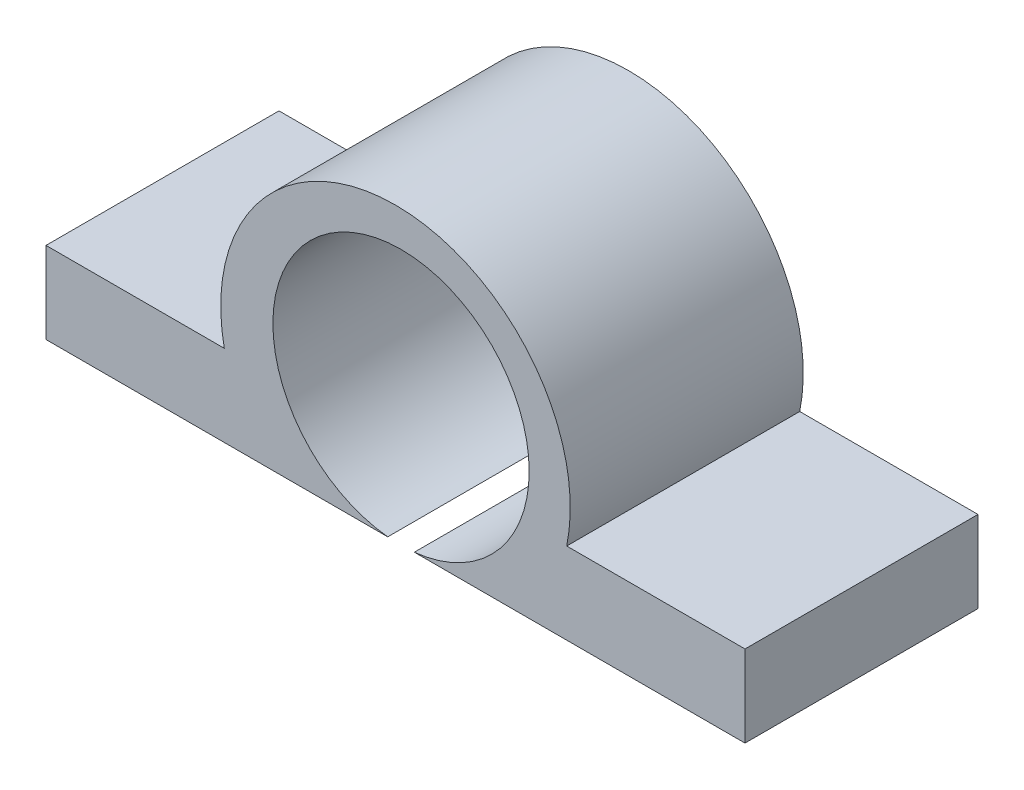
ISO-10303-21;
HEADER;
FILE_DESCRIPTION(('STEP AP214'),'2;1');
FILE_NAME('part.step','',(''),(''),'','','');
FILE_SCHEMA(('AUTOMOTIVE_DESIGN { 1 0 10303 214 1 1 1 1 }'));
ENDSEC;
DATA;
#1=APPLICATION_CONTEXT('core data for automotive mechanical design processes');
#2=APPLICATION_PROTOCOL_DEFINITION('international standard','automotive_design',2000,#1);
#3=PRODUCT_CONTEXT('',#1,'mechanical');
#4=PRODUCT('Part','Part','',(#3));
#5=PRODUCT_RELATED_PRODUCT_CATEGORY('part','',(#4));
#6=PRODUCT_DEFINITION_FORMATION('','',#4);
#7=PRODUCT_DEFINITION_CONTEXT('part definition',#1,'design');
#8=PRODUCT_DEFINITION('design','',#6,#7);
#9=PRODUCT_DEFINITION_SHAPE('','',#8);
#10=(LENGTH_UNIT() NAMED_UNIT(*) SI_UNIT(.MILLI.,.METRE.));
#11=(NAMED_UNIT(*) PLANE_ANGLE_UNIT() SI_UNIT($,.RADIAN.));
#12=(NAMED_UNIT(*) SI_UNIT($,.STERADIAN.) SOLID_ANGLE_UNIT());
#13=UNCERTAINTY_MEASURE_WITH_UNIT(LENGTH_MEASURE(1.E-05),#10,'distance_accuracy_value','');
#14=(GEOMETRIC_REPRESENTATION_CONTEXT(3) GLOBAL_UNCERTAINTY_ASSIGNED_CONTEXT((#13)) GLOBAL_UNIT_ASSIGNED_CONTEXT((#10,
#11,#12)) REPRESENTATION_CONTEXT('',''));
#15=CARTESIAN_POINT('',(0.,0.,0.));
#16=DIRECTION('',(0.,0.,1.));
#17=DIRECTION('',(1.,0.,0.));
#18=AXIS2_PLACEMENT_3D('',#15,#16,#17);
#19=CARTESIAN_POINT('',(-30.,-3.5,20.));
#20=DIRECTION('',(0.,1.,0.));
#21=DIRECTION('',(0.,0.,1.));
#22=AXIS2_PLACEMENT_3D('',#19,#20,#21);
#23=PLANE('',#22);
#24=DIRECTION('',(1.,0.,0.));
#25=VECTOR('',#24,1.);
#26=CARTESIAN_POINT('',(-30.,-3.5,0.));
#27=LINE('',#26,#25);
#28=CARTESIAN_POINT('',(-30.,-3.5,0.));
#29=VERTEX_POINT('',#28);
#30=CARTESIAN_POINT('',(-0.666377477827946,-3.5,0.));
#31=VERTEX_POINT('',#30);
#32=EDGE_CURVE('E161',#29,#31,#27,.T.);
#33=ORIENTED_EDGE('',*,*,#32,.T.);
#34=DIRECTION('',(0.,0.,1.));
#35=VECTOR('',#34,1.);
#36=CARTESIAN_POINT('',(-0.666377477827928,-3.5,0.));
#37=LINE('',#36,#35);
#38=CARTESIAN_POINT('',(-0.666377477827946,-3.5,20.));
#39=VERTEX_POINT('',#38);
#40=EDGE_CURVE('E55',#31,#39,#37,.T.);
#41=ORIENTED_EDGE('',*,*,#40,.T.);
#42=DIRECTION('',(1.,0.,0.));
#43=VECTOR('',#42,1.);
#44=CARTESIAN_POINT('',(-30.,-3.5,20.));
#45=LINE('',#44,#43);
#46=CARTESIAN_POINT('',(-30.,-3.5,20.));
#47=VERTEX_POINT('',#46);
#48=EDGE_CURVE('E140',#47,#39,#45,.T.);
#49=ORIENTED_EDGE('',*,*,#48,.F.);
#50=DIRECTION('',(0.,0.,-1.));
#51=VECTOR('',#50,1.);
#52=CARTESIAN_POINT('',(-30.,-3.5,20.));
#53=LINE('',#52,#51);
#54=EDGE_CURVE('E132',#47,#29,#53,.T.);
#55=ORIENTED_EDGE('',*,*,#54,.T.);
#56=EDGE_LOOP('',(#33,#41,#49,#55));
#57=FACE_BOUND('',#56,.T.);
#58=ADVANCED_FACE('F39',(#57),#23,.F.);
#59=CARTESIAN_POINT('',(30.,3.5,20.));
#60=DIRECTION('',(-1.,0.,0.));
#61=DIRECTION('',(0.,-1.,0.));
#62=AXIS2_PLACEMENT_3D('',#59,#60,#61);
#63=PLANE('',#62);
#64=DIRECTION('',(0.,1.,0.));
#65=VECTOR('',#64,1.);
#66=CARTESIAN_POINT('',(30.,3.5,0.));
#67=LINE('',#66,#65);
#68=CARTESIAN_POINT('',(30.,-3.5,0.));
#69=VERTEX_POINT('',#68);
#70=CARTESIAN_POINT('',(30.,3.5,0.));
#71=VERTEX_POINT('',#70);
#72=EDGE_CURVE('E146',#69,#71,#67,.T.);
#73=ORIENTED_EDGE('',*,*,#72,.T.);
#74=DIRECTION('',(0.,0.,-1.));
#75=VECTOR('',#74,1.);
#76=CARTESIAN_POINT('',(30.,3.5,20.));
#77=LINE('',#76,#75);
#78=CARTESIAN_POINT('',(30.,3.5,20.));
#79=VERTEX_POINT('',#78);
#80=EDGE_CURVE('E48',#79,#71,#77,.T.);
#81=ORIENTED_EDGE('',*,*,#80,.F.);
#82=DIRECTION('',(0.,1.,0.));
#83=VECTOR('',#82,1.);
#84=CARTESIAN_POINT('',(30.,3.5,20.));
#85=LINE('',#84,#83);
#86=CARTESIAN_POINT('',(30.,-3.5,20.));
#87=VERTEX_POINT('',#86);
#88=EDGE_CURVE('E165',#87,#79,#85,.T.);
#89=ORIENTED_EDGE('',*,*,#88,.F.);
#90=DIRECTION('',(0.,0.,-1.));
#91=VECTOR('',#90,1.);
#92=CARTESIAN_POINT('',(30.,-3.5,20.));
#93=LINE('',#92,#91);
#94=EDGE_CURVE('E145',#87,#69,#93,.T.);
#95=ORIENTED_EDGE('',*,*,#94,.T.);
#96=EDGE_LOOP('',(#73,#81,#89,#95));
#97=FACE_BOUND('',#96,.T.);
#98=ADVANCED_FACE('F41',(#97),#63,.F.);
#99=CARTESIAN_POINT('',(14.6969384566991,3.5,20.));
#100=DIRECTION('',(0.,-1.,0.));
#101=DIRECTION('',(1.,0.,0.));
#102=AXIS2_PLACEMENT_3D('',#99,#100,#101);
#103=PLANE('',#102);
#104=DIRECTION('',(-1.,0.,0.));
#105=VECTOR('',#104,1.);
#106=CARTESIAN_POINT('',(14.6969384566991,3.5,0.));
#107=LINE('',#106,#105);
#108=CARTESIAN_POINT('',(14.6969384566991,3.5,0.));
#109=VERTEX_POINT('',#108);
#110=EDGE_CURVE('E150',#71,#109,#107,.T.);
#111=ORIENTED_EDGE('',*,*,#110,.T.);
#112=DIRECTION('',(0.,0.,-1.));
#113=VECTOR('',#112,1.);
#114=CARTESIAN_POINT('',(14.6969384566991,3.5,20.));
#115=LINE('',#114,#113);
#116=CARTESIAN_POINT('',(14.6969384566991,3.5,20.));
#117=VERTEX_POINT('',#116);
#118=EDGE_CURVE('E172',#117,#109,#115,.T.);
#119=ORIENTED_EDGE('',*,*,#118,.F.);
#120=DIRECTION('',(-1.,0.,0.));
#121=VECTOR('',#120,1.);
#122=CARTESIAN_POINT('',(14.6969384566991,3.5,20.));
#123=LINE('',#122,#121);
#124=EDGE_CURVE('E100',#79,#117,#123,.T.);
#125=ORIENTED_EDGE('',*,*,#124,.F.);
#126=ORIENTED_EDGE('',*,*,#80,.T.);
#127=EDGE_LOOP('',(#111,#119,#125,#126));
#128=FACE_BOUND('',#127,.T.);
#129=ADVANCED_FACE('F177',(#128),#103,.F.);
#130=CARTESIAN_POINT('',(0.,6.5,20.));
#131=DIRECTION('',(0.,0.,-1.));
#132=DIRECTION('',(-1.,0.,0.));
#133=AXIS2_PLACEMENT_3D('',#130,#131,#132);
#134=CYLINDRICAL_SURFACE('',#133,15.);
#135=CARTESIAN_POINT('',(0.,6.5,0.));
#136=DIRECTION('',(0.,0.,1.));
#137=DIRECTION('',(1.,0.,0.));
#138=AXIS2_PLACEMENT_3D('',#135,#136,#137);
#139=CIRCLE('',#138,15.);
#140=CARTESIAN_POINT('',(-14.6969384566991,3.5,0.));
#141=VERTEX_POINT('',#140);
#142=EDGE_CURVE('E153',#109,#141,#139,.T.);
#143=ORIENTED_EDGE('',*,*,#142,.T.);
#144=DIRECTION('',(0.,0.,-1.));
#145=VECTOR('',#144,1.);
#146=CARTESIAN_POINT('',(-14.6969384566991,3.5,20.));
#147=LINE('',#146,#145);
#148=CARTESIAN_POINT('',(-14.6969384566991,3.5,20.));
#149=VERTEX_POINT('',#148);
#150=EDGE_CURVE('E131',#149,#141,#147,.T.);
#151=ORIENTED_EDGE('',*,*,#150,.F.);
#152=CARTESIAN_POINT('',(0.,6.5,20.));
#153=DIRECTION('',(0.,0.,1.));
#154=DIRECTION('',(1.,0.,0.));
#155=AXIS2_PLACEMENT_3D('',#152,#153,#154);
#156=CIRCLE('',#155,15.);
#157=EDGE_CURVE('E117',#117,#149,#156,.T.);
#158=ORIENTED_EDGE('',*,*,#157,.F.);
#159=ORIENTED_EDGE('',*,*,#118,.T.);
#160=EDGE_LOOP('',(#143,#151,#158,#159));
#161=FACE_BOUND('',#160,.T.);
#162=ADVANCED_FACE('F186',(#161),#134,.T.);
#163=CARTESIAN_POINT('',(-30.,3.5,20.));
#164=DIRECTION('',(0.,-1.,0.));
#165=DIRECTION('',(1.,0.,0.));
#166=AXIS2_PLACEMENT_3D('',#163,#164,#165);
#167=PLANE('',#166);
#168=DIRECTION('',(-1.,0.,0.));
#169=VECTOR('',#168,1.);
#170=CARTESIAN_POINT('',(-30.,3.5,0.));
#171=LINE('',#170,#169);
#172=CARTESIAN_POINT('',(-30.,3.5,0.));
#173=VERTEX_POINT('',#172);
#174=EDGE_CURVE('E127',#141,#173,#171,.T.);
#175=ORIENTED_EDGE('',*,*,#174,.T.);
#176=DIRECTION('',(0.,0.,-1.));
#177=VECTOR('',#176,1.);
#178=CARTESIAN_POINT('',(-30.,3.5,20.));
#179=LINE('',#178,#177);
#180=CARTESIAN_POINT('',(-30.,3.5,20.));
#181=VERTEX_POINT('',#180);
#182=EDGE_CURVE('E124',#181,#173,#179,.T.);
#183=ORIENTED_EDGE('',*,*,#182,.F.);
#184=DIRECTION('',(-1.,0.,0.));
#185=VECTOR('',#184,1.);
#186=CARTESIAN_POINT('',(-30.,3.5,20.));
#187=LINE('',#186,#185);
#188=EDGE_CURVE('E109',#149,#181,#187,.T.);
#189=ORIENTED_EDGE('',*,*,#188,.F.);
#190=ORIENTED_EDGE('',*,*,#150,.T.);
#191=EDGE_LOOP('',(#175,#183,#189,#190));
#192=FACE_BOUND('',#191,.T.);
#193=ADVANCED_FACE('F125',(#192),#167,.F.);
#194=CARTESIAN_POINT('',(-30.,3.5,20.));
#195=DIRECTION('',(1.,0.,0.));
#196=DIRECTION('',(0.,0.,-1.));
#197=AXIS2_PLACEMENT_3D('',#194,#195,#196);
#198=PLANE('',#197);
#199=DIRECTION('',(0.,-1.,0.));
#200=VECTOR('',#199,1.);
#201=CARTESIAN_POINT('',(-30.,3.5,0.));
#202=LINE('',#201,#200);
#203=EDGE_CURVE('E158',#173,#29,#202,.T.);
#204=ORIENTED_EDGE('',*,*,#203,.T.);
#205=ORIENTED_EDGE('',*,*,#54,.F.);
#206=DIRECTION('',(0.,-1.,0.));
#207=VECTOR('',#206,1.);
#208=CARTESIAN_POINT('',(-30.,3.5,20.));
#209=LINE('',#208,#207);
#210=EDGE_CURVE('E114',#181,#47,#209,.T.);
#211=ORIENTED_EDGE('',*,*,#210,.F.);
#212=ORIENTED_EDGE('',*,*,#182,.T.);
#213=EDGE_LOOP('',(#204,#205,#211,#212));
#214=FACE_BOUND('',#213,.T.);
#215=ADVANCED_FACE('F134',(#214),#198,.F.);
#216=CARTESIAN_POINT('',(1.6164567840368,-3.5,20.));
#217=VERTEX_POINT('',#216);
#218=EDGE_CURVE('E63',#217,#87,#45,.T.);
#219=ORIENTED_EDGE('',*,*,#218,.F.);
#220=DIRECTION('',(0.,0.,1.));
#221=VECTOR('',#220,1.);
#222=CARTESIAN_POINT('',(1.61645678403678,-3.5,0.));
#223=LINE('',#222,#221);
#224=CARTESIAN_POINT('',(1.6164567840368,-3.5,0.));
#225=VERTEX_POINT('',#224);
#226=EDGE_CURVE('E195',#217,#225,#223,.F.);
#227=ORIENTED_EDGE('',*,*,#226,.T.);
#228=EDGE_CURVE('E91',#225,#69,#27,.T.);
#229=ORIENTED_EDGE('',*,*,#228,.T.);
#230=ORIENTED_EDGE('',*,*,#94,.F.);
#231=EDGE_LOOP('',(#219,#227,#229,#230));
#232=FACE_BOUND('',#231,.T.);
#233=ADVANCED_FACE('F206',(#232),#23,.F.);
#234=CARTESIAN_POINT('',(0.,6.5,20.));
#235=DIRECTION('',(0.,0.,1.));
#236=DIRECTION('',(1.,0.,0.));
#237=AXIS2_PLACEMENT_3D('',#234,#235,#236);
#238=PLANE('',#237);
#239=CARTESIAN_POINT('',(0.475039653104428,7.44062004336199,20.));
#240=DIRECTION('',(0.,0.,1.));
#241=DIRECTION('',(1.,0.,0.));
#242=AXIS2_PLACEMENT_3D('',#239,#240,#241);
#243=CIRCLE('',#242,11.);
#244=EDGE_CURVE('E198',#217,#39,#243,.T.);
#245=ORIENTED_EDGE('',*,*,#244,.F.);
#246=ORIENTED_EDGE('',*,*,#218,.T.);
#247=ORIENTED_EDGE('',*,*,#88,.T.);
#248=ORIENTED_EDGE('',*,*,#124,.T.);
#249=ORIENTED_EDGE('',*,*,#157,.T.);
#250=ORIENTED_EDGE('',*,*,#188,.T.);
#251=ORIENTED_EDGE('',*,*,#210,.T.);
#252=ORIENTED_EDGE('',*,*,#48,.T.);
#253=EDGE_LOOP('',(#245,#246,#247,#248,#249,#250,#251,#252));
#254=FACE_BOUND('',#253,.T.);
#255=ADVANCED_FACE('F111',(#254),#238,.T.);
#256=CARTESIAN_POINT('',(0.,6.5,0.));
#257=DIRECTION('',(0.,0.,1.));
#258=DIRECTION('',(1.,0.,0.));
#259=AXIS2_PLACEMENT_3D('',#256,#257,#258);
#260=PLANE('',#259);
#261=ORIENTED_EDGE('',*,*,#228,.F.);
#262=CARTESIAN_POINT('',(0.475039653104428,7.44062004336199,0.));
#263=DIRECTION('',(0.,0.,1.));
#264=DIRECTION('',(1.,0.,0.));
#265=AXIS2_PLACEMENT_3D('',#262,#263,#264);
#266=CIRCLE('',#265,11.);
#267=EDGE_CURVE('E11',#225,#31,#266,.T.);
#268=ORIENTED_EDGE('',*,*,#267,.T.);
#269=ORIENTED_EDGE('',*,*,#32,.F.);
#270=ORIENTED_EDGE('',*,*,#203,.F.);
#271=ORIENTED_EDGE('',*,*,#174,.F.);
#272=ORIENTED_EDGE('',*,*,#142,.F.);
#273=ORIENTED_EDGE('',*,*,#110,.F.);
#274=ORIENTED_EDGE('',*,*,#72,.F.);
#275=EDGE_LOOP('',(#261,#268,#269,#270,#271,#272,#273,#274));
#276=FACE_BOUND('',#275,.T.);
#277=ADVANCED_FACE('F182',(#276),#260,.F.);
#278=CARTESIAN_POINT('',(0.475039653104428,7.44062004336199,0.));
#279=DIRECTION('',(0.,0.,1.));
#280=DIRECTION('',(1.,0.,0.));
#281=AXIS2_PLACEMENT_3D('',#278,#279,#280);
#282=CYLINDRICAL_SURFACE('',#281,11.);
#283=ORIENTED_EDGE('',*,*,#267,.F.);
#284=ORIENTED_EDGE('',*,*,#226,.F.);
#285=ORIENTED_EDGE('',*,*,#244,.T.);
#286=ORIENTED_EDGE('',*,*,#40,.F.);
#287=EDGE_LOOP('',(#283,#284,#285,#286));
#288=FACE_BOUND('',#287,.T.);
#289=ADVANCED_FACE('F202',(#288),#282,.F.);
#290=CLOSED_SHELL('',(#58,#98,#129,#162,#193,#215,#233,#255,#277,#289));
#291=MANIFOLD_SOLID_BREP('B2',#290);
#292=ADVANCED_BREP_SHAPE_REPRESENTATION('',(#18,#291),#14);
#293=SHAPE_DEFINITION_REPRESENTATION(#9,#292);
ENDSEC;
END-ISO-10303-21;
